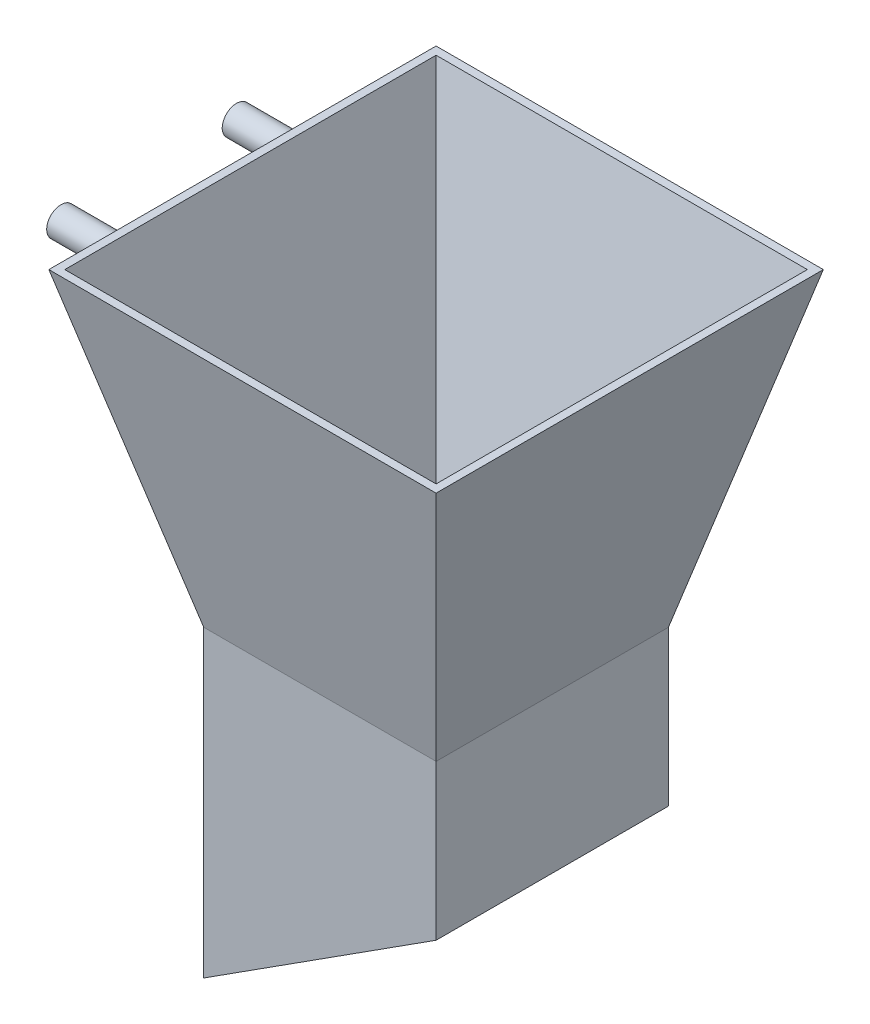
ISO-10303-21;
HEADER;
FILE_DESCRIPTION(('STEP AP214'),'2;1');
FILE_NAME('part.step','',(''),(''),'','','');
FILE_SCHEMA(('AUTOMOTIVE_DESIGN { 1 0 10303 214 1 1 1 1 }'));
ENDSEC;
DATA;
#1=APPLICATION_CONTEXT('core data for automotive mechanical design processes');
#2=APPLICATION_PROTOCOL_DEFINITION('international standard','automotive_design',2000,#1);
#3=PRODUCT_CONTEXT('',#1,'mechanical');
#4=PRODUCT('Part','Part','',(#3));
#5=PRODUCT_RELATED_PRODUCT_CATEGORY('part','',(#4));
#6=PRODUCT_DEFINITION_FORMATION('','',#4);
#7=PRODUCT_DEFINITION_CONTEXT('part definition',#1,'design');
#8=PRODUCT_DEFINITION('design','',#6,#7);
#9=PRODUCT_DEFINITION_SHAPE('','',#8);
#10=(LENGTH_UNIT() NAMED_UNIT(*) SI_UNIT(.MILLI.,.METRE.));
#11=(NAMED_UNIT(*) PLANE_ANGLE_UNIT() SI_UNIT($,.RADIAN.));
#12=(NAMED_UNIT(*) SI_UNIT($,.STERADIAN.) SOLID_ANGLE_UNIT());
#13=UNCERTAINTY_MEASURE_WITH_UNIT(LENGTH_MEASURE(1.E-05),#10,'distance_accuracy_value','');
#14=(GEOMETRIC_REPRESENTATION_CONTEXT(3) GLOBAL_UNCERTAINTY_ASSIGNED_CONTEXT((#13)) GLOBAL_UNIT_ASSIGNED_CONTEXT((#10,
#11,#12)) REPRESENTATION_CONTEXT('',''));
#15=CARTESIAN_POINT('',(0.,0.,0.));
#16=DIRECTION('',(0.,0.,1.));
#17=DIRECTION('',(1.,0.,0.));
#18=AXIS2_PLACEMENT_3D('',#15,#16,#17);
#19=CARTESIAN_POINT('',(-121.,-74.725401962788,-136.682880253871));
#20=DIRECTION('',(1.,0.,0.));
#21=DIRECTION('',(0.,0.,-1.));
#22=AXIS2_PLACEMENT_3D('',#19,#20,#21);
#23=CYLINDRICAL_SURFACE('',#22,18.4816077554572);
#24=CARTESIAN_POINT('',(-121.,-74.725401962788,-136.682880253871));
#25=DIRECTION('',(1.,0.,0.));
#26=DIRECTION('',(0.,0.,1.));
#27=AXIS2_PLACEMENT_3D('',#24,#25,#26);
#28=CIRCLE('',#27,18.4816077554572);
#29=CARTESIAN_POINT('',(-121.,-74.725401962788,-118.201272498414));
#30=VERTEX_POINT('',#29);
#31=EDGE_CURVE('E12',#30,#30,#28,.T.);
#32=ORIENTED_EDGE('',*,*,#31,.T.);
#33=EDGE_LOOP('',(#32));
#34=FACE_BOUND('',#33,.T.);
#35=CARTESIAN_POINT('',(10.,-74.725401962788,-136.682880253871));
#36=DIRECTION('',(1.,0.,0.));
#37=DIRECTION('',(0.,0.,1.));
#38=AXIS2_PLACEMENT_3D('',#35,#36,#37);
#39=CIRCLE('',#38,18.4816077554572);
#40=CARTESIAN_POINT('',(10.,-74.725401962788,-118.201272498414));
#41=VERTEX_POINT('',#40);
#42=EDGE_CURVE('E56',#41,#41,#39,.T.);
#43=ORIENTED_EDGE('',*,*,#42,.F.);
#44=EDGE_LOOP('',(#43));
#45=FACE_BOUND('',#44,.T.);
#46=ADVANCED_FACE('F50',(#34,#45),#23,.T.);
#47=CARTESIAN_POINT('',(-121.,-74.725401962788,-136.682880253871));
#48=DIRECTION('',(-1.,0.,0.));
#49=DIRECTION('',(0.,0.,1.));
#50=AXIS2_PLACEMENT_3D('',#47,#48,#49);
#51=PLANE('',#50);
#52=ORIENTED_EDGE('',*,*,#31,.F.);
#53=EDGE_LOOP('',(#52));
#54=FACE_BOUND('',#53,.T.);
#55=ADVANCED_FACE('F65',(#54),#51,.T.);
#56=CARTESIAN_POINT('',(10.,-74.725401962788,-136.682880253871));
#57=DIRECTION('',(-1.,0.,0.));
#58=DIRECTION('',(0.,0.,1.));
#59=AXIS2_PLACEMENT_3D('',#56,#57,#58);
#60=PLANE('',#59);
#61=ORIENTED_EDGE('',*,*,#42,.T.);
#62=EDGE_LOOP('',(#61));
#63=FACE_BOUND('',#62,.T.);
#64=ADVANCED_FACE('F62',(#63),#60,.F.);
#65=CLOSED_SHELL('',(#46,#55,#64));
#66=MANIFOLD_SOLID_BREP('B2',#65);
#67=CARTESIAN_POINT('',(-121.,-74.725401962788,-363.31711974613));
#68=DIRECTION('',(1.,0.,0.));
#69=DIRECTION('',(0.,0.,-1.));
#70=AXIS2_PLACEMENT_3D('',#67,#68,#69);
#71=CYLINDRICAL_SURFACE('',#70,18.4816077554572);
#72=CARTESIAN_POINT('',(-121.,-74.725401962788,-363.31711974613));
#73=DIRECTION('',(1.,0.,0.));
#74=DIRECTION('',(0.,0.,-1.));
#75=AXIS2_PLACEMENT_3D('',#72,#73,#74);
#76=CIRCLE('',#75,18.4816077554572);
#77=CARTESIAN_POINT('',(-121.,-74.725401962788,-381.798727501587));
#78=VERTEX_POINT('',#77);
#79=EDGE_CURVE('E49',#78,#78,#76,.T.);
#80=ORIENTED_EDGE('',*,*,#79,.T.);
#81=EDGE_LOOP('',(#80));
#82=FACE_BOUND('',#81,.T.);
#83=CARTESIAN_POINT('',(10.,-74.725401962788,-363.31711974613));
#84=DIRECTION('',(1.,0.,0.));
#85=DIRECTION('',(0.,0.,-1.));
#86=AXIS2_PLACEMENT_3D('',#83,#84,#85);
#87=CIRCLE('',#86,18.4816077554572);
#88=CARTESIAN_POINT('',(10.,-74.725401962788,-381.798727501587));
#89=VERTEX_POINT('',#88);
#90=EDGE_CURVE('E106',#89,#89,#87,.T.);
#91=ORIENTED_EDGE('',*,*,#90,.F.);
#92=EDGE_LOOP('',(#91));
#93=FACE_BOUND('',#92,.T.);
#94=ADVANCED_FACE('F100',(#82,#93),#71,.T.);
#95=CARTESIAN_POINT('',(-121.,-74.725401962788,-363.31711974613));
#96=DIRECTION('',(1.,0.,0.));
#97=DIRECTION('',(0.,0.,-1.));
#98=AXIS2_PLACEMENT_3D('',#95,#96,#97);
#99=PLANE('',#98);
#100=ORIENTED_EDGE('',*,*,#79,.F.);
#101=EDGE_LOOP('',(#100));
#102=FACE_BOUND('',#101,.T.);
#103=ADVANCED_FACE('F115',(#102),#99,.F.);
#104=CARTESIAN_POINT('',(10.,-74.725401962788,-363.31711974613));
#105=DIRECTION('',(1.,0.,0.));
#106=DIRECTION('',(0.,0.,-1.));
#107=AXIS2_PLACEMENT_3D('',#104,#105,#106);
#108=PLANE('',#107);
#109=ORIENTED_EDGE('',*,*,#90,.T.);
#110=EDGE_LOOP('',(#109));
#111=FACE_BOUND('',#110,.T.);
#112=ADVANCED_FACE('F112',(#111),#108,.T.);
#113=CLOSED_SHELL('',(#94,#103,#112));
#114=MANIFOLD_SOLID_BREP('B7',#113);
#115=CARTESIAN_POINT('',(0.,0.,0.));
#116=DIRECTION('',(0.,-1.,0.));
#117=DIRECTION('',(0.,0.,-1.));
#118=AXIS2_PLACEMENT_3D('',#115,#116,#117);
#119=PLANE('',#118);
#120=DIRECTION('',(0.,0.,1.));
#121=VECTOR('',#120,1.);
#122=CARTESIAN_POINT('',(0.,0.,0.));
#123=LINE('',#122,#121);
#124=CARTESIAN_POINT('',(0.,0.,-500.));
#125=VERTEX_POINT('',#124);
#126=CARTESIAN_POINT('',(0.,0.,0.));
#127=VERTEX_POINT('',#126);
#128=EDGE_CURVE('E339',#125,#127,#123,.T.);
#129=ORIENTED_EDGE('',*,*,#128,.T.);
#130=DIRECTION('',(1.,0.,0.));
#131=VECTOR('',#130,1.);
#132=CARTESIAN_POINT('',(0.,0.,0.));
#133=LINE('',#132,#131);
#134=CARTESIAN_POINT('',(500.,0.,0.));
#135=VERTEX_POINT('',#134);
#136=EDGE_CURVE('E314',#127,#135,#133,.T.);
#137=ORIENTED_EDGE('',*,*,#136,.T.);
#138=DIRECTION('',(0.,0.,-1.));
#139=VECTOR('',#138,1.);
#140=CARTESIAN_POINT('',(500.,0.,0.));
#141=LINE('',#140,#139);
#142=CARTESIAN_POINT('',(500.,0.,-500.));
#143=VERTEX_POINT('',#142);
#144=EDGE_CURVE('E380',#135,#143,#141,.T.);
#145=ORIENTED_EDGE('',*,*,#144,.T.);
#146=DIRECTION('',(-1.,0.,0.));
#147=VECTOR('',#146,1.);
#148=CARTESIAN_POINT('',(0.,0.,-500.));
#149=LINE('',#148,#147);
#150=EDGE_CURVE('E415',#143,#125,#149,.T.);
#151=ORIENTED_EDGE('',*,*,#150,.T.);
#152=EDGE_LOOP('',(#129,#137,#145,#151));
#153=FACE_BOUND('',#152,.T.);
#154=DIRECTION('',(0.,0.,1.));
#155=VECTOR('',#154,1.);
#156=CARTESIAN_POINT('',(10.3077640640442,0.,0.));
#157=LINE('',#156,#155);
#158=CARTESIAN_POINT('',(10.3077640640441,0.,-489.692235935956));
#159=VERTEX_POINT('',#158);
#160=CARTESIAN_POINT('',(10.3077640640442,0.,-10.3077640640441));
#161=VERTEX_POINT('',#160);
#162=EDGE_CURVE('E280',#159,#161,#157,.T.);
#163=ORIENTED_EDGE('',*,*,#162,.F.);
#164=DIRECTION('',(-1.,0.,0.));
#165=VECTOR('',#164,1.);
#166=CARTESIAN_POINT('',(0.,0.,-489.692235935956));
#167=LINE('',#166,#165);
#168=CARTESIAN_POINT('',(489.692235935956,0.,-489.692235935956));
#169=VERTEX_POINT('',#168);
#170=EDGE_CURVE('E293',#169,#159,#167,.T.);
#171=ORIENTED_EDGE('',*,*,#170,.F.);
#172=DIRECTION('',(0.,0.,-1.));
#173=VECTOR('',#172,1.);
#174=CARTESIAN_POINT('',(489.692235935956,0.,0.));
#175=LINE('',#174,#173);
#176=CARTESIAN_POINT('',(489.692235935956,0.,-10.3077640640441));
#177=VERTEX_POINT('',#176);
#178=EDGE_CURVE('E264',#177,#169,#175,.T.);
#179=ORIENTED_EDGE('',*,*,#178,.F.);
#180=DIRECTION('',(1.,0.,0.));
#181=VECTOR('',#180,1.);
#182=CARTESIAN_POINT('',(0.,0.,-10.3077640640441));
#183=LINE('',#182,#181);
#184=EDGE_CURVE('E266',#161,#177,#183,.T.);
#185=ORIENTED_EDGE('',*,*,#184,.F.);
#186=EDGE_LOOP('',(#163,#171,#179,#185));
#187=FACE_BOUND('',#186,.T.);
#188=ADVANCED_FACE('F140',(#153,#187),#119,.F.);
#189=CARTESIAN_POINT('',(0.,-117.64705882353,-470.588235294118));
#190=DIRECTION('',(0.,-0.242535625036333,-0.970142500145332));
#191=DIRECTION('',(0.,0.970142500145332,-0.242535625036333));
#192=AXIS2_PLACEMENT_3D('',#189,#190,#191);
#193=PLANE('',#192);
#194=DIRECTION('',(-0.235702260395516,-0.942809041582063,0.235702260395516));
#195=VECTOR('',#194,1.);
#196=CARTESIAN_POINT('',(500.,0.,-500.));
#197=LINE('',#196,#195);
#198=CARTESIAN_POINT('',(400.,-400.,-400.));
#199=VERTEX_POINT('',#198);
#200=EDGE_CURVE('E379',#143,#199,#197,.T.);
#201=ORIENTED_EDGE('',*,*,#200,.T.);
#202=DIRECTION('',(-1.,0.,0.));
#203=VECTOR('',#202,1.);
#204=CARTESIAN_POINT('',(100.,-400.,-400.));
#205=LINE('',#204,#203);
#206=CARTESIAN_POINT('',(100.,-400.,-400.));
#207=VERTEX_POINT('',#206);
#208=EDGE_CURVE('E98',#199,#207,#205,.T.);
#209=ORIENTED_EDGE('',*,*,#208,.T.);
#210=DIRECTION('',(0.235702260395516,-0.942809041582063,0.235702260395516));
#211=VECTOR('',#210,1.);
#212=CARTESIAN_POINT('',(0.,0.,-500.));
#213=LINE('',#212,#211);
#214=EDGE_CURVE('E332',#125,#207,#213,.T.);
#215=ORIENTED_EDGE('',*,*,#214,.F.);
#216=ORIENTED_EDGE('',*,*,#150,.F.);
#217=EDGE_LOOP('',(#201,#209,#215,#216));
#218=FACE_BOUND('',#217,.T.);
#219=ADVANCED_FACE('F356',(#218),#193,.T.);
#220=CARTESIAN_POINT('',(0.,0.,0.));
#221=DIRECTION('',(-0.970142500145332,-0.242535625036333,0.));
#222=DIRECTION('',(0.242535625036333,-0.970142500145332,0.));
#223=AXIS2_PLACEMENT_3D('',#220,#221,#222);
#224=PLANE('',#223);
#225=ORIENTED_EDGE('',*,*,#214,.T.);
#226=DIRECTION('',(0.,0.,1.));
#227=VECTOR('',#226,1.);
#228=CARTESIAN_POINT('',(100.,-400.,-400.));
#229=LINE('',#228,#227);
#230=CARTESIAN_POINT('',(100.,-400.,-100.));
#231=VERTEX_POINT('',#230);
#232=EDGE_CURVE('E145',#207,#231,#229,.T.);
#233=ORIENTED_EDGE('',*,*,#232,.T.);
#234=DIRECTION('',(0.235702260395516,-0.942809041582063,-0.235702260395516));
#235=VECTOR('',#234,1.);
#236=CARTESIAN_POINT('',(0.,0.,0.));
#237=LINE('',#236,#235);
#238=EDGE_CURVE('E319',#127,#231,#237,.T.);
#239=ORIENTED_EDGE('',*,*,#238,.F.);
#240=ORIENTED_EDGE('',*,*,#128,.F.);
#241=EDGE_LOOP('',(#225,#233,#239,#240));
#242=FACE_BOUND('',#241,.T.);
#243=ADVANCED_FACE('F346',(#242),#224,.T.);
#244=CARTESIAN_POINT('',(470.588235294118,-117.647058823529,0.));
#245=DIRECTION('',(0.970142500145332,-0.242535625036333,0.));
#246=DIRECTION('',(0.242535625036333,0.970142500145332,0.));
#247=AXIS2_PLACEMENT_3D('',#244,#245,#246);
#248=PLANE('',#247);
#249=DIRECTION('',(-0.235702260395516,-0.942809041582063,-0.235702260395516));
#250=VECTOR('',#249,1.);
#251=CARTESIAN_POINT('',(500.,0.,0.));
#252=LINE('',#251,#250);
#253=CARTESIAN_POINT('',(400.,-400.,-100.));
#254=VERTEX_POINT('',#253);
#255=EDGE_CURVE('E327',#135,#254,#252,.T.);
#256=ORIENTED_EDGE('',*,*,#255,.T.);
#257=DIRECTION('',(0.,0.,-1.));
#258=VECTOR('',#257,1.);
#259=CARTESIAN_POINT('',(400.,-400.,-400.));
#260=LINE('',#259,#258);
#261=EDGE_CURVE('E326',#254,#199,#260,.T.);
#262=ORIENTED_EDGE('',*,*,#261,.T.);
#263=ORIENTED_EDGE('',*,*,#200,.F.);
#264=ORIENTED_EDGE('',*,*,#144,.F.);
#265=EDGE_LOOP('',(#256,#262,#263,#264));
#266=FACE_BOUND('',#265,.T.);
#267=ADVANCED_FACE('F355',(#266),#248,.T.);
#268=CARTESIAN_POINT('',(0.,0.,0.));
#269=DIRECTION('',(0.,-0.242535625036333,0.970142500145332));
#270=DIRECTION('',(0.,-0.970142500145332,-0.242535625036333));
#271=AXIS2_PLACEMENT_3D('',#268,#269,#270);
#272=PLANE('',#271);
#273=ORIENTED_EDGE('',*,*,#238,.T.);
#274=DIRECTION('',(1.,0.,0.));
#275=VECTOR('',#274,1.);
#276=CARTESIAN_POINT('',(100.,-400.,-99.9999999999999));
#277=LINE('',#276,#275);
#278=EDGE_CURVE('E457',#231,#254,#277,.T.);
#279=ORIENTED_EDGE('',*,*,#278,.T.);
#280=ORIENTED_EDGE('',*,*,#255,.F.);
#281=ORIENTED_EDGE('',*,*,#136,.F.);
#282=EDGE_LOOP('',(#273,#279,#280,#281));
#283=FACE_BOUND('',#282,.T.);
#284=ADVANCED_FACE('F142',(#283),#272,.T.);
#285=CARTESIAN_POINT('',(400.,-600.,-100.));
#286=DIRECTION('',(-1.,0.,0.));
#287=DIRECTION('',(0.,0.,1.));
#288=AXIS2_PLACEMENT_3D('',#285,#286,#287);
#289=PLANE('',#288);
#290=ORIENTED_EDGE('',*,*,#261,.F.);
#291=DIRECTION('',(0.,1.,0.));
#292=VECTOR('',#291,1.);
#293=CARTESIAN_POINT('',(400.,-600.,-100.));
#294=LINE('',#293,#292);
#295=CARTESIAN_POINT('',(400.,-600.,-100.));
#296=VERTEX_POINT('',#295);
#297=EDGE_CURVE('E446',#296,#254,#294,.T.);
#298=ORIENTED_EDGE('',*,*,#297,.F.);
#299=DIRECTION('',(0.,0.,1.));
#300=VECTOR('',#299,1.);
#301=CARTESIAN_POINT('',(400.,-600.,-100.));
#302=LINE('',#301,#300);
#303=CARTESIAN_POINT('',(400.,-600.,-400.));
#304=VERTEX_POINT('',#303);
#305=EDGE_CURVE('E300',#304,#296,#302,.T.);
#306=ORIENTED_EDGE('',*,*,#305,.F.);
#307=DIRECTION('',(0.,1.,0.));
#308=VECTOR('',#307,1.);
#309=CARTESIAN_POINT('',(400.,-600.,-400.));
#310=LINE('',#309,#308);
#311=EDGE_CURVE('E308',#304,#199,#310,.T.);
#312=ORIENTED_EDGE('',*,*,#311,.T.);
#313=EDGE_LOOP('',(#290,#298,#306,#312));
#314=FACE_BOUND('',#313,.T.);
#315=ADVANCED_FACE('F400',(#314),#289,.F.);
#316=CARTESIAN_POINT('',(100.,-600.,-100.));
#317=DIRECTION('',(0.,0.,-1.));
#318=DIRECTION('',(-1.,0.,0.));
#319=AXIS2_PLACEMENT_3D('',#316,#317,#318);
#320=PLANE('',#319);
#321=ORIENTED_EDGE('',*,*,#278,.F.);
#322=DIRECTION('',(0.,1.,0.));
#323=VECTOR('',#322,1.);
#324=CARTESIAN_POINT('',(100.,-600.,-100.));
#325=LINE('',#324,#323);
#326=CARTESIAN_POINT('',(100.,-792.175192929181,-100.));
#327=VERTEX_POINT('',#326);
#328=EDGE_CURVE('E453',#327,#231,#325,.T.);
#329=ORIENTED_EDGE('',*,*,#328,.F.);
#330=DIRECTION('',(0.842048065661697,0.539402498247269,0.));
#331=VECTOR('',#330,1.);
#332=CARTESIAN_POINT('',(100.,-792.175192929181,-100.));
#333=LINE('',#332,#331);
#334=EDGE_CURVE('E237',#327,#296,#333,.T.);
#335=ORIENTED_EDGE('',*,*,#334,.T.);
#336=ORIENTED_EDGE('',*,*,#297,.T.);
#337=EDGE_LOOP('',(#321,#329,#335,#336));
#338=FACE_BOUND('',#337,.T.);
#339=ADVANCED_FACE('F484',(#338),#320,.F.);
#340=CARTESIAN_POINT('',(100.,-600.,-100.));
#341=DIRECTION('',(1.,0.,0.));
#342=DIRECTION('',(0.,0.,-1.));
#343=AXIS2_PLACEMENT_3D('',#340,#341,#342);
#344=PLANE('',#343);
#345=ORIENTED_EDGE('',*,*,#232,.F.);
#346=DIRECTION('',(0.,1.,0.));
#347=VECTOR('',#346,1.);
#348=CARTESIAN_POINT('',(100.,-600.,-400.));
#349=LINE('',#348,#347);
#350=CARTESIAN_POINT('',(100.,-792.175192929181,-400.));
#351=VERTEX_POINT('',#350);
#352=EDGE_CURVE('E166',#351,#207,#349,.T.);
#353=ORIENTED_EDGE('',*,*,#352,.F.);
#354=DIRECTION('',(0.,0.,1.));
#355=VECTOR('',#354,1.);
#356=CARTESIAN_POINT('',(100.,-792.175192929181,-756.27419886566));
#357=LINE('',#356,#355);
#358=EDGE_CURVE('E301',#351,#327,#357,.T.);
#359=ORIENTED_EDGE('',*,*,#358,.T.);
#360=ORIENTED_EDGE('',*,*,#328,.T.);
#361=EDGE_LOOP('',(#345,#353,#359,#360));
#362=FACE_BOUND('',#361,.T.);
#363=ADVANCED_FACE('F474',(#362),#344,.F.);
#364=CARTESIAN_POINT('',(100.,-600.,-400.));
#365=DIRECTION('',(0.,0.,1.));
#366=DIRECTION('',(1.,0.,0.));
#367=AXIS2_PLACEMENT_3D('',#364,#365,#366);
#368=PLANE('',#367);
#369=ORIENTED_EDGE('',*,*,#208,.F.);
#370=ORIENTED_EDGE('',*,*,#311,.F.);
#371=DIRECTION('',(-0.842048065661697,-0.539402498247269,0.));
#372=VECTOR('',#371,1.);
#373=CARTESIAN_POINT('',(100.,-792.175192929181,-400.));
#374=LINE('',#373,#372);
#375=EDGE_CURVE('E298',#304,#351,#374,.T.);
#376=ORIENTED_EDGE('',*,*,#375,.T.);
#377=ORIENTED_EDGE('',*,*,#352,.T.);
#378=EDGE_LOOP('',(#369,#370,#376,#377));
#379=FACE_BOUND('',#378,.T.);
#380=ADVANCED_FACE('F483',(#379),#368,.F.);
#381=CARTESIAN_POINT('',(100.,-792.175192929181,-756.27419886566));
#382=DIRECTION('',(0.539402498247269,-0.842048065661697,0.));
#383=DIRECTION('',(0.842048065661697,0.539402498247269,0.));
#384=AXIS2_PLACEMENT_3D('',#381,#382,#383);
#385=PLANE('',#384);
#386=ORIENTED_EDGE('',*,*,#375,.F.);
#387=ORIENTED_EDGE('',*,*,#305,.T.);
#388=ORIENTED_EDGE('',*,*,#334,.F.);
#389=ORIENTED_EDGE('',*,*,#358,.F.);
#390=EDGE_LOOP('',(#386,#387,#388,#389));
#391=FACE_BOUND('',#390,.T.);
#392=ADVANCED_FACE('F589',(#391),#385,.T.);
#393=CARTESIAN_POINT('',(0.,-115.221702573166,-460.886810292664));
#394=DIRECTION('',(0.,-0.242535625036333,-0.970142500145332));
#395=DIRECTION('',(0.,0.970142500145332,-0.242535625036333));
#396=AXIS2_PLACEMENT_3D('',#393,#394,#395);
#397=PLANE('',#396);
#398=DIRECTION('',(-0.235702260395516,-0.942809041582063,0.235702260395516));
#399=VECTOR('',#398,1.);
#400=CARTESIAN_POINT('',(435.281987498627,-217.640993749314,-435.281987498627));
#401=LINE('',#400,#399);
#402=CARTESIAN_POINT('',(390.,-398.768943743823,-390.));
#403=VERTEX_POINT('',#402);
#404=EDGE_CURVE('E158',#169,#403,#401,.T.);
#405=ORIENTED_EDGE('',*,*,#404,.F.);
#406=ORIENTED_EDGE('',*,*,#170,.T.);
#407=DIRECTION('',(0.235702260395516,-0.942809041582063,0.235702260395516));
#408=VECTOR('',#407,1.);
#409=CARTESIAN_POINT('',(36.9402347235948,-106.529882638203,-463.059765276405));
#410=LINE('',#409,#408);
#411=CARTESIAN_POINT('',(110.,-398.768943743824,-390.));
#412=VERTEX_POINT('',#411);
#413=EDGE_CURVE('E235',#159,#412,#410,.T.);
#414=ORIENTED_EDGE('',*,*,#413,.T.);
#415=DIRECTION('',(-1.,0.,0.));
#416=VECTOR('',#415,1.);
#417=CARTESIAN_POINT('',(0.,-398.768943743824,-390.));
#418=LINE('',#417,#416);
#419=EDGE_CURVE('E231',#403,#412,#418,.T.);
#420=ORIENTED_EDGE('',*,*,#419,.F.);
#421=EDGE_LOOP('',(#405,#406,#414,#420));
#422=FACE_BOUND('',#421,.T.);
#423=ADVANCED_FACE('F233',(#422),#397,.F.);
#424=CARTESIAN_POINT('',(9.70142500145337,2.42535625036334,0.));
#425=DIRECTION('',(-0.970142500145332,-0.242535625036333,0.));
#426=DIRECTION('',(0.242535625036333,-0.970142500145332,0.));
#427=AXIS2_PLACEMENT_3D('',#424,#425,#426);
#428=PLANE('',#427);
#429=ORIENTED_EDGE('',*,*,#413,.F.);
#430=ORIENTED_EDGE('',*,*,#162,.T.);
#431=DIRECTION('',(0.235702260395516,-0.942809041582063,-0.235702260395516));
#432=VECTOR('',#431,1.);
#433=CARTESIAN_POINT('',(9.16245694581708,4.58122847290852,-9.16245694581701));
#434=LINE('',#433,#432);
#435=CARTESIAN_POINT('',(110.,-398.768943743824,-110.));
#436=VERTEX_POINT('',#435);
#437=EDGE_CURVE('E260',#161,#436,#434,.T.);
#438=ORIENTED_EDGE('',*,*,#437,.T.);
#439=DIRECTION('',(0.,0.,1.));
#440=VECTOR('',#439,1.);
#441=CARTESIAN_POINT('',(110.,-398.768943743823,2.21361231424923E-13));
#442=LINE('',#441,#440);
#443=EDGE_CURVE('E238',#412,#436,#442,.T.);
#444=ORIENTED_EDGE('',*,*,#443,.F.);
#445=EDGE_LOOP('',(#429,#430,#438,#444));
#446=FACE_BOUND('',#445,.T.);
#447=ADVANCED_FACE('F560',(#446),#428,.F.);
#448=CARTESIAN_POINT('',(460.886810292664,-115.221702573166,0.));
#449=DIRECTION('',(0.970142500145332,-0.242535625036333,0.));
#450=DIRECTION('',(0.242535625036333,0.970142500145332,0.));
#451=AXIS2_PLACEMENT_3D('',#448,#449,#450);
#452=PLANE('',#451);
#453=DIRECTION('',(-0.235702260395516,-0.942809041582063,-0.235702260395516));
#454=VECTOR('',#453,1.);
#455=CARTESIAN_POINT('',(463.059765276405,-106.529882638203,-36.9402347235948));
#456=LINE('',#455,#454);
#457=CARTESIAN_POINT('',(390.,-398.768943743824,-110.));
#458=VERTEX_POINT('',#457);
#459=EDGE_CURVE('E268',#177,#458,#456,.T.);
#460=ORIENTED_EDGE('',*,*,#459,.F.);
#461=ORIENTED_EDGE('',*,*,#178,.T.);
#462=ORIENTED_EDGE('',*,*,#404,.T.);
#463=DIRECTION('',(0.,0.,-1.));
#464=VECTOR('',#463,1.);
#465=CARTESIAN_POINT('',(390.,-398.768943743824,-2.95148308566565E-13));
#466=LINE('',#465,#464);
#467=EDGE_CURVE('E253',#458,#403,#466,.T.);
#468=ORIENTED_EDGE('',*,*,#467,.F.);
#469=EDGE_LOOP('',(#460,#461,#462,#468));
#470=FACE_BOUND('',#469,.T.);
#471=ADVANCED_FACE('F262',(#470),#452,.F.);
#472=CARTESIAN_POINT('',(0.,2.42535625036332,-9.70142500145331));
#473=DIRECTION('',(0.,-0.242535625036333,0.970142500145332));
#474=DIRECTION('',(0.,-0.970142500145332,-0.242535625036333));
#475=AXIS2_PLACEMENT_3D('',#472,#473,#474);
#476=PLANE('',#475);
#477=ORIENTED_EDGE('',*,*,#437,.F.);
#478=ORIENTED_EDGE('',*,*,#184,.T.);
#479=ORIENTED_EDGE('',*,*,#459,.T.);
#480=DIRECTION('',(1.,0.,0.));
#481=VECTOR('',#480,1.);
#482=CARTESIAN_POINT('',(0.,-398.768943743824,-110.));
#483=LINE('',#482,#481);
#484=EDGE_CURVE('E259',#436,#458,#483,.T.);
#485=ORIENTED_EDGE('',*,*,#484,.F.);
#486=EDGE_LOOP('',(#477,#478,#479,#485));
#487=FACE_BOUND('',#486,.T.);
#488=ADVANCED_FACE('F571',(#487),#476,.F.);
#489=CARTESIAN_POINT('',(390.,-600.,-100.));
#490=DIRECTION('',(-1.,0.,0.));
#491=DIRECTION('',(0.,0.,1.));
#492=AXIS2_PLACEMENT_3D('',#489,#490,#491);
#493=PLANE('',#492);
#494=ORIENTED_EDGE('',*,*,#467,.T.);
#495=DIRECTION('',(0.,1.,0.));
#496=VECTOR('',#495,1.);
#497=CARTESIAN_POINT('',(390.,-600.,-390.));
#498=LINE('',#497,#496);
#499=CARTESIAN_POINT('',(390.,-594.530033135451,-390.));
#500=VERTEX_POINT('',#499);
#501=EDGE_CURVE('E242',#500,#403,#498,.T.);
#502=ORIENTED_EDGE('',*,*,#501,.F.);
#503=DIRECTION('',(0.,0.,1.));
#504=VECTOR('',#503,1.);
#505=CARTESIAN_POINT('',(390.,-594.530033135451,-100.));
#506=LINE('',#505,#504);
#507=CARTESIAN_POINT('',(390.,-594.530033135451,-110.));
#508=VERTEX_POINT('',#507);
#509=EDGE_CURVE('E250',#500,#508,#506,.T.);
#510=ORIENTED_EDGE('',*,*,#509,.T.);
#511=DIRECTION('',(0.,1.,0.));
#512=VECTOR('',#511,1.);
#513=CARTESIAN_POINT('',(390.,-600.,-110.));
#514=LINE('',#513,#512);
#515=EDGE_CURVE('E255',#508,#458,#514,.T.);
#516=ORIENTED_EDGE('',*,*,#515,.T.);
#517=EDGE_LOOP('',(#494,#502,#510,#516));
#518=FACE_BOUND('',#517,.T.);
#519=ADVANCED_FACE('F254',(#518),#493,.T.);
#520=CARTESIAN_POINT('',(100.,-600.,-110.));
#521=DIRECTION('',(0.,0.,-1.));
#522=DIRECTION('',(-1.,0.,0.));
#523=AXIS2_PLACEMENT_3D('',#520,#521,#522);
#524=PLANE('',#523);
#525=ORIENTED_EDGE('',*,*,#484,.T.);
#526=ORIENTED_EDGE('',*,*,#515,.F.);
#527=DIRECTION('',(0.842048065661697,0.539402498247269,0.));
#528=VECTOR('',#527,1.);
#529=CARTESIAN_POINT('',(94.6059750175274,-783.754712272564,-110.));
#530=LINE('',#529,#528);
#531=CARTESIAN_POINT('',(110.,-773.89354653602,-110.));
#532=VERTEX_POINT('',#531);
#533=EDGE_CURVE('E285',#532,#508,#530,.T.);
#534=ORIENTED_EDGE('',*,*,#533,.F.);
#535=DIRECTION('',(0.,1.,0.));
#536=VECTOR('',#535,1.);
#537=CARTESIAN_POINT('',(110.,-600.,-110.));
#538=LINE('',#537,#536);
#539=EDGE_CURVE('E281',#532,#436,#538,.T.);
#540=ORIENTED_EDGE('',*,*,#539,.T.);
#541=EDGE_LOOP('',(#525,#526,#534,#540));
#542=FACE_BOUND('',#541,.T.);
#543=ADVANCED_FACE('F569',(#542),#524,.T.);
#544=CARTESIAN_POINT('',(110.,-600.,-100.));
#545=DIRECTION('',(1.,0.,0.));
#546=DIRECTION('',(0.,0.,-1.));
#547=AXIS2_PLACEMENT_3D('',#544,#545,#546);
#548=PLANE('',#547);
#549=ORIENTED_EDGE('',*,*,#443,.T.);
#550=ORIENTED_EDGE('',*,*,#539,.F.);
#551=DIRECTION('',(0.,0.,1.));
#552=VECTOR('',#551,1.);
#553=CARTESIAN_POINT('',(110.,-773.89354653602,-756.27419886566));
#554=LINE('',#553,#552);
#555=CARTESIAN_POINT('',(110.,-773.89354653602,-390.));
#556=VERTEX_POINT('',#555);
#557=EDGE_CURVE('E288',#556,#532,#554,.T.);
#558=ORIENTED_EDGE('',*,*,#557,.F.);
#559=DIRECTION('',(0.,1.,0.));
#560=VECTOR('',#559,1.);
#561=CARTESIAN_POINT('',(110.,-600.,-390.));
#562=LINE('',#561,#560);
#563=EDGE_CURVE('E249',#556,#412,#562,.T.);
#564=ORIENTED_EDGE('',*,*,#563,.T.);
#565=EDGE_LOOP('',(#549,#550,#558,#564));
#566=FACE_BOUND('',#565,.T.);
#567=ADVANCED_FACE('F563',(#566),#548,.T.);
#568=CARTESIAN_POINT('',(100.,-600.,-390.));
#569=DIRECTION('',(0.,0.,1.));
#570=DIRECTION('',(1.,0.,0.));
#571=AXIS2_PLACEMENT_3D('',#568,#569,#570);
#572=PLANE('',#571);
#573=ORIENTED_EDGE('',*,*,#419,.T.);
#574=ORIENTED_EDGE('',*,*,#563,.F.);
#575=DIRECTION('',(-0.842048065661697,-0.539402498247269,0.));
#576=VECTOR('',#575,1.);
#577=CARTESIAN_POINT('',(94.6059750175274,-783.754712272564,-390.));
#578=LINE('',#577,#576);
#579=EDGE_CURVE('E246',#500,#556,#578,.T.);
#580=ORIENTED_EDGE('',*,*,#579,.F.);
#581=ORIENTED_EDGE('',*,*,#501,.T.);
#582=EDGE_LOOP('',(#573,#574,#580,#581));
#583=FACE_BOUND('',#582,.T.);
#584=ADVANCED_FACE('F244',(#583),#572,.T.);
#585=CARTESIAN_POINT('',(94.6059750175274,-783.754712272564,-756.27419886566));
#586=DIRECTION('',(0.539402498247269,-0.842048065661697,0.));
#587=DIRECTION('',(0.842048065661697,0.539402498247269,0.));
#588=AXIS2_PLACEMENT_3D('',#585,#586,#587);
#589=PLANE('',#588);
#590=ORIENTED_EDGE('',*,*,#579,.T.);
#591=ORIENTED_EDGE('',*,*,#557,.T.);
#592=ORIENTED_EDGE('',*,*,#533,.T.);
#593=ORIENTED_EDGE('',*,*,#509,.F.);
#594=EDGE_LOOP('',(#590,#591,#592,#593));
#595=FACE_BOUND('',#594,.T.);
#596=ADVANCED_FACE('F566',(#595),#589,.F.);
#597=CLOSED_SHELL('',(#188,#219,#243,#267,#284,#315,#339,#363,#380,#392,#423,#447,#471,#488,
#519,#543,#567,#584,#596));
#598=MANIFOLD_SOLID_BREP('B44',#597);
#599=ADVANCED_BREP_SHAPE_REPRESENTATION('',(#18,#66,#114,#598),#14);
#600=SHAPE_DEFINITION_REPRESENTATION(#9,#599);
ENDSEC;
END-ISO-10303-21;
